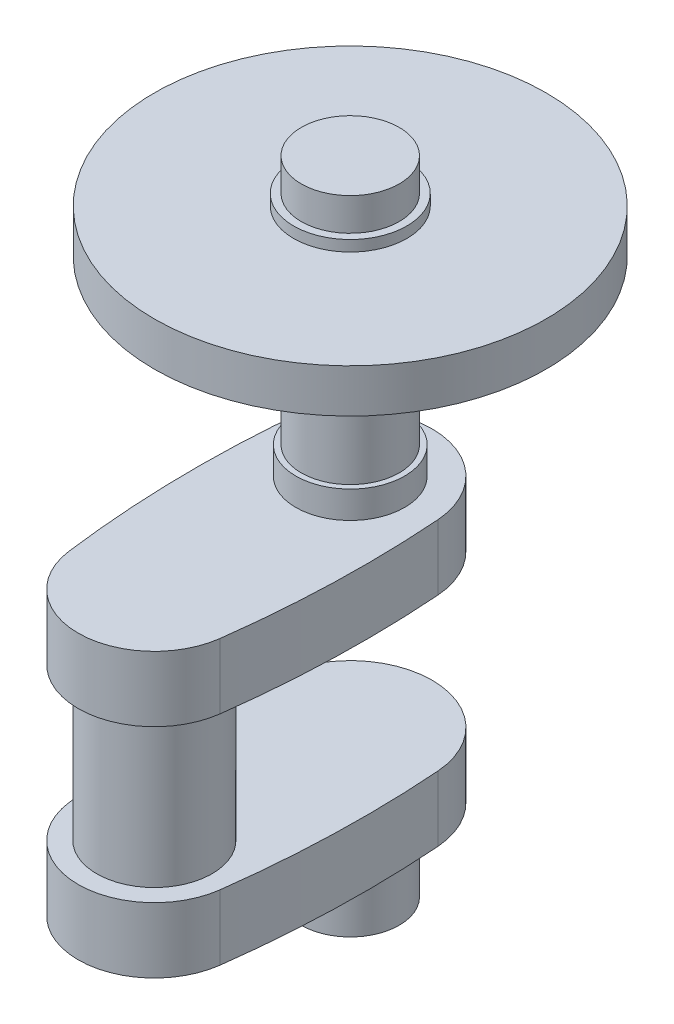
ISO-10303-21;
HEADER;
FILE_DESCRIPTION(('STEP AP214'),'2;1');
FILE_NAME('part.step','',(''),(''),'','','');
FILE_SCHEMA(('AUTOMOTIVE_DESIGN { 1 0 10303 214 1 1 1 1 }'));
ENDSEC;
DATA;
#1=APPLICATION_CONTEXT('core data for automotive mechanical design processes');
#2=APPLICATION_PROTOCOL_DEFINITION('international standard','automotive_design',2000,#1);
#3=PRODUCT_CONTEXT('',#1,'mechanical');
#4=PRODUCT('Part','Part','',(#3));
#5=PRODUCT_RELATED_PRODUCT_CATEGORY('part','',(#4));
#6=PRODUCT_DEFINITION_FORMATION('','',#4);
#7=PRODUCT_DEFINITION_CONTEXT('part definition',#1,'design');
#8=PRODUCT_DEFINITION('design','',#6,#7);
#9=PRODUCT_DEFINITION_SHAPE('','',#8);
#10=(LENGTH_UNIT() NAMED_UNIT(*) SI_UNIT(.MILLI.,.METRE.));
#11=(NAMED_UNIT(*) PLANE_ANGLE_UNIT() SI_UNIT($,.RADIAN.));
#12=(NAMED_UNIT(*) SI_UNIT($,.STERADIAN.) SOLID_ANGLE_UNIT());
#13=UNCERTAINTY_MEASURE_WITH_UNIT(LENGTH_MEASURE(1.E-05),#10,'distance_accuracy_value','');
#14=(GEOMETRIC_REPRESENTATION_CONTEXT(3) GLOBAL_UNCERTAINTY_ASSIGNED_CONTEXT((#13)) GLOBAL_UNIT_ASSIGNED_CONTEXT((#10,
#11,#12)) REPRESENTATION_CONTEXT('',''));
#15=CARTESIAN_POINT('',(0.,0.,0.));
#16=DIRECTION('',(0.,0.,1.));
#17=DIRECTION('',(1.,0.,0.));
#18=AXIS2_PLACEMENT_3D('',#15,#16,#17);
#19=CARTESIAN_POINT('',(0.,95.,0.));
#20=DIRECTION('',(0.,1.,0.));
#21=DIRECTION('',(0.,0.,1.));
#22=AXIS2_PLACEMENT_3D('',#19,#20,#21);
#23=PLANE('',#22);
#24=CARTESIAN_POINT('',(0.,95.,0.));
#25=DIRECTION('',(0.,1.,0.));
#26=DIRECTION('',(0.,0.,1.));
#27=AXIS2_PLACEMENT_3D('',#24,#25,#26);
#28=CIRCLE('',#27,90.);
#29=CARTESIAN_POINT('',(0.,95.,90.));
#30=VERTEX_POINT('',#29);
#31=EDGE_CURVE('E220',#30,#30,#28,.T.);
#32=ORIENTED_EDGE('',*,*,#31,.T.);
#33=EDGE_LOOP('',(#32));
#34=FACE_BOUND('',#33,.T.);
#35=CARTESIAN_POINT('',(0.,95.,0.));
#36=DIRECTION('',(0.,1.,0.));
#37=DIRECTION('',(0.,0.,1.));
#38=AXIS2_PLACEMENT_3D('',#35,#36,#37);
#39=CIRCLE('',#38,26.);
#40=CARTESIAN_POINT('',(0.,95.,26.));
#41=VERTEX_POINT('',#40);
#42=EDGE_CURVE('E217',#41,#41,#39,.T.);
#43=ORIENTED_EDGE('',*,*,#42,.F.);
#44=EDGE_LOOP('',(#43));
#45=FACE_BOUND('',#44,.T.);
#46=ADVANCED_FACE('F32',(#34,#45),#23,.T.);
#47=CARTESIAN_POINT('',(220.308520154453,-42.5,16.099781946578));
#48=DIRECTION('',(0.,-1.,0.));
#49=DIRECTION('',(0.,0.,-1.));
#50=AXIS2_PLACEMENT_3D('',#47,#48,#49);
#51=PLANE('',#50);
#52=CARTESIAN_POINT('',(440.617040308905,-42.5,32.199563893156));
#53=DIRECTION('',(0.,-1.,0.));
#54=DIRECTION('',(0.,0.,-1.));
#55=AXIS2_PLACEMENT_3D('',#52,#53,#54);
#56=CIRCLE('',#55,479.392019083062);
#57=CARTESIAN_POINT('',(-34.7026853511723,-42.5,94.5523213218674));
#58=VERTEX_POINT('',#57);
#59=CARTESIAN_POINT('',(-37.5,-42.5,-2.7404379212089));
#60=VERTEX_POINT('',#59);
#61=EDGE_CURVE('E174',#58,#60,#56,.T.);
#62=ORIENTED_EDGE('',*,*,#61,.T.);
#63=CARTESIAN_POINT('',(0.,-42.5,0.));
#64=DIRECTION('',(0.,-1.,0.));
#65=DIRECTION('',(0.,0.,-1.));
#66=AXIS2_PLACEMENT_3D('',#63,#64,#65);
#67=CIRCLE('',#66,37.6);
#68=CARTESIAN_POINT('',(37.5,-42.5,-2.74043792120891));
#69=VERTEX_POINT('',#68);
#70=EDGE_CURVE('E83',#60,#69,#67,.T.);
#71=ORIENTED_EDGE('',*,*,#70,.T.);
#72=CARTESIAN_POINT('',(-440.617040308905,-42.5,32.199563893156));
#73=DIRECTION('',(0.,-1.,0.));
#74=DIRECTION('',(0.,0.,1.));
#75=AXIS2_PLACEMENT_3D('',#72,#73,#74);
#76=CIRCLE('',#75,479.392019083062);
#77=CARTESIAN_POINT('',(34.7026853511724,-42.5,94.5523213218674));
#78=VERTEX_POINT('',#77);
#79=EDGE_CURVE('E177',#69,#78,#76,.T.);
#80=ORIENTED_EDGE('',*,*,#79,.T.);
#81=CARTESIAN_POINT('',(0.,-42.5,90.));
#82=DIRECTION('',(0.,-1.,0.));
#83=DIRECTION('',(0.,0.,-1.));
#84=AXIS2_PLACEMENT_3D('',#81,#82,#83);
#85=CIRCLE('',#84,35.);
#86=EDGE_CURVE('E51',#78,#58,#85,.T.);
#87=ORIENTED_EDGE('',*,*,#86,.T.);
#88=EDGE_LOOP('',(#62,#71,#80,#87));
#89=FACE_BOUND('',#88,.T.);
#90=CARTESIAN_POINT('',(0.,-42.5,90.));
#91=DIRECTION('',(0.,-1.,0.));
#92=DIRECTION('',(0.,0.,-1.));
#93=AXIS2_PLACEMENT_3D('',#90,#91,#92);
#94=CIRCLE('',#93,26.5);
#95=CARTESIAN_POINT('',(0.,-42.5,63.5));
#96=VERTEX_POINT('',#95);
#97=EDGE_CURVE('E170',#96,#96,#94,.T.);
#98=ORIENTED_EDGE('',*,*,#97,.F.);
#99=EDGE_LOOP('',(#98));
#100=FACE_BOUND('',#99,.T.);
#101=ADVANCED_FACE('F249',(#89,#100),#51,.T.);
#102=CARTESIAN_POINT('',(0.,25.,0.));
#103=DIRECTION('',(0.,-1.,0.));
#104=DIRECTION('',(0.,0.,-1.));
#105=AXIS2_PLACEMENT_3D('',#102,#103,#104);
#106=CYLINDRICAL_SURFACE('',#105,22.5);
#107=CARTESIAN_POINT('',(0.,70.,0.));
#108=DIRECTION('',(0.,-1.,0.));
#109=DIRECTION('',(0.,0.,-1.));
#110=AXIS2_PLACEMENT_3D('',#107,#108,#109);
#111=CIRCLE('',#110,22.5);
#112=CARTESIAN_POINT('',(0.,70.,-22.5));
#113=VERTEX_POINT('',#112);
#114=EDGE_CURVE('E201',#113,#113,#111,.T.);
#115=ORIENTED_EDGE('',*,*,#114,.T.);
#116=EDGE_LOOP('',(#115));
#117=FACE_BOUND('',#116,.T.);
#118=CARTESIAN_POINT('',(0.,0.,0.));
#119=DIRECTION('',(0.,1.,0.));
#120=DIRECTION('',(0.,0.,1.));
#121=AXIS2_PLACEMENT_3D('',#118,#119,#120);
#122=CIRCLE('',#121,22.5);
#123=CARTESIAN_POINT('',(0.,0.,22.5));
#124=VERTEX_POINT('',#123);
#125=EDGE_CURVE('E42',#124,#124,#122,.T.);
#126=ORIENTED_EDGE('',*,*,#125,.T.);
#127=EDGE_LOOP('',(#126));
#128=FACE_BOUND('',#127,.T.);
#129=ADVANCED_FACE('F34',(#117,#128),#106,.T.);
#130=CARTESIAN_POINT('',(0.,0.,0.));
#131=DIRECTION('',(0.,1.,0.));
#132=DIRECTION('',(0.,0.,1.));
#133=AXIS2_PLACEMENT_3D('',#130,#131,#132);
#134=PLANE('',#133);
#135=CARTESIAN_POINT('',(0.,0.,0.));
#136=DIRECTION('',(0.,1.,0.));
#137=DIRECTION('',(0.,0.,1.));
#138=AXIS2_PLACEMENT_3D('',#135,#136,#137);
#139=CIRCLE('',#138,25.);
#140=CARTESIAN_POINT('',(0.,0.,25.));
#141=VERTEX_POINT('',#140);
#142=EDGE_CURVE('E197',#141,#141,#139,.T.);
#143=ORIENTED_EDGE('',*,*,#142,.T.);
#144=EDGE_LOOP('',(#143));
#145=FACE_BOUND('',#144,.T.);
#146=ORIENTED_EDGE('',*,*,#125,.F.);
#147=EDGE_LOOP('',(#146));
#148=FACE_BOUND('',#147,.T.);
#149=ADVANCED_FACE('F315',(#145,#148),#134,.T.);
#150=CARTESIAN_POINT('',(0.,-12.5,0.));
#151=DIRECTION('',(0.,1.,0.));
#152=DIRECTION('',(0.,0.,1.));
#153=AXIS2_PLACEMENT_3D('',#150,#151,#152);
#154=CYLINDRICAL_SURFACE('',#153,25.);
#155=CARTESIAN_POINT('',(0.,-12.5,0.));
#156=DIRECTION('',(0.,-1.,0.));
#157=DIRECTION('',(0.,0.,-1.));
#158=AXIS2_PLACEMENT_3D('',#155,#156,#157);
#159=CIRCLE('',#158,25.);
#160=CARTESIAN_POINT('',(0.,-12.5,-25.));
#161=VERTEX_POINT('',#160);
#162=EDGE_CURVE('E194',#161,#161,#159,.F.);
#163=ORIENTED_EDGE('',*,*,#162,.T.);
#164=EDGE_LOOP('',(#163));
#165=FACE_BOUND('',#164,.T.);
#166=ORIENTED_EDGE('',*,*,#142,.F.);
#167=EDGE_LOOP('',(#166));
#168=FACE_BOUND('',#167,.T.);
#169=ADVANCED_FACE('F313',(#165,#168),#154,.T.);
#170=CARTESIAN_POINT('',(440.617040308905,-42.5,32.199563893156));
#171=DIRECTION('',(0.,1.,0.));
#172=DIRECTION('',(0.,0.,1.));
#173=AXIS2_PLACEMENT_3D('',#170,#171,#172);
#174=CYLINDRICAL_SURFACE('',#173,479.392019083062);
#175=CARTESIAN_POINT('',(440.617040308905,-12.5,32.199563893156));
#176=DIRECTION('',(0.,-1.,0.));
#177=DIRECTION('',(0.,0.,-1.));
#178=AXIS2_PLACEMENT_3D('',#175,#176,#177);
#179=CIRCLE('',#178,479.392019083062);
#180=CARTESIAN_POINT('',(-34.7026853511723,-12.5,94.5523213218674));
#181=VERTEX_POINT('',#180);
#182=CARTESIAN_POINT('',(-37.5,-12.5,-2.7404379212089));
#183=VERTEX_POINT('',#182);
#184=EDGE_CURVE('E173',#181,#183,#179,.T.);
#185=ORIENTED_EDGE('',*,*,#184,.T.);
#186=DIRECTION('',(0.,1.,0.));
#187=VECTOR('',#186,1.);
#188=CARTESIAN_POINT('',(-37.5,-42.5,-2.7404379212089));
#189=LINE('',#188,#187);
#190=EDGE_CURVE('E192',#60,#183,#189,.T.);
#191=ORIENTED_EDGE('',*,*,#190,.F.);
#192=ORIENTED_EDGE('',*,*,#61,.F.);
#193=DIRECTION('',(0.,1.,0.));
#194=VECTOR('',#193,1.);
#195=CARTESIAN_POINT('',(-34.7026853511723,-42.5,94.5523213218674));
#196=LINE('',#195,#194);
#197=EDGE_CURVE('E180',#58,#181,#196,.T.);
#198=ORIENTED_EDGE('',*,*,#197,.T.);
#199=EDGE_LOOP('',(#185,#191,#192,#198));
#200=FACE_BOUND('',#199,.T.);
#201=ADVANCED_FACE('F310',(#200),#174,.T.);
#202=CARTESIAN_POINT('',(0.,-42.5,0.));
#203=DIRECTION('',(0.,1.,0.));
#204=DIRECTION('',(0.,0.,1.));
#205=AXIS2_PLACEMENT_3D('',#202,#203,#204);
#206=CYLINDRICAL_SURFACE('',#205,37.6);
#207=CARTESIAN_POINT('',(0.,-12.5,0.));
#208=DIRECTION('',(0.,-1.,0.));
#209=DIRECTION('',(0.,0.,-1.));
#210=AXIS2_PLACEMENT_3D('',#207,#208,#209);
#211=CIRCLE('',#210,37.6);
#212=CARTESIAN_POINT('',(37.5,-12.5,-2.74043792120891));
#213=VERTEX_POINT('',#212);
#214=EDGE_CURVE('E183',#183,#213,#211,.T.);
#215=ORIENTED_EDGE('',*,*,#214,.T.);
#216=DIRECTION('',(0.,1.,0.));
#217=VECTOR('',#216,1.);
#218=CARTESIAN_POINT('',(37.5,-42.5,-2.74043792120891));
#219=LINE('',#218,#217);
#220=EDGE_CURVE('E190',#69,#213,#219,.T.);
#221=ORIENTED_EDGE('',*,*,#220,.F.);
#222=ORIENTED_EDGE('',*,*,#70,.F.);
#223=ORIENTED_EDGE('',*,*,#190,.T.);
#224=EDGE_LOOP('',(#215,#221,#222,#223));
#225=FACE_BOUND('',#224,.T.);
#226=ADVANCED_FACE('F307',(#225),#206,.T.);
#227=CARTESIAN_POINT('',(-440.617040308905,-42.5,32.199563893156));
#228=DIRECTION('',(0.,1.,0.));
#229=DIRECTION('',(0.,0.,1.));
#230=AXIS2_PLACEMENT_3D('',#227,#228,#229);
#231=CYLINDRICAL_SURFACE('',#230,479.392019083062);
#232=CARTESIAN_POINT('',(-440.617040308905,-12.5,32.199563893156));
#233=DIRECTION('',(0.,-1.,0.));
#234=DIRECTION('',(0.,0.,1.));
#235=AXIS2_PLACEMENT_3D('',#232,#233,#234);
#236=CIRCLE('',#235,479.392019083062);
#237=CARTESIAN_POINT('',(34.7026853511724,-12.5,94.5523213218674));
#238=VERTEX_POINT('',#237);
#239=EDGE_CURVE('E69',#213,#238,#236,.T.);
#240=ORIENTED_EDGE('',*,*,#239,.T.);
#241=DIRECTION('',(0.,1.,0.));
#242=VECTOR('',#241,1.);
#243=CARTESIAN_POINT('',(34.7026853511724,-42.5,94.5523213218674));
#244=LINE('',#243,#242);
#245=EDGE_CURVE('E188',#78,#238,#244,.T.);
#246=ORIENTED_EDGE('',*,*,#245,.F.);
#247=ORIENTED_EDGE('',*,*,#79,.F.);
#248=ORIENTED_EDGE('',*,*,#220,.T.);
#249=EDGE_LOOP('',(#240,#246,#247,#248));
#250=FACE_BOUND('',#249,.T.);
#251=ADVANCED_FACE('F304',(#250),#231,.T.);
#252=CARTESIAN_POINT('',(0.,-42.5,90.));
#253=DIRECTION('',(0.,1.,0.));
#254=DIRECTION('',(0.,0.,1.));
#255=AXIS2_PLACEMENT_3D('',#252,#253,#254);
#256=CYLINDRICAL_SURFACE('',#255,35.);
#257=CARTESIAN_POINT('',(0.,-12.5,90.));
#258=DIRECTION('',(0.,-1.,0.));
#259=DIRECTION('',(0.,0.,-1.));
#260=AXIS2_PLACEMENT_3D('',#257,#258,#259);
#261=CIRCLE('',#260,35.);
#262=EDGE_CURVE('E75',#238,#181,#261,.T.);
#263=ORIENTED_EDGE('',*,*,#262,.T.);
#264=ORIENTED_EDGE('',*,*,#197,.F.);
#265=ORIENTED_EDGE('',*,*,#86,.F.);
#266=ORIENTED_EDGE('',*,*,#245,.T.);
#267=EDGE_LOOP('',(#263,#264,#265,#266));
#268=FACE_BOUND('',#267,.T.);
#269=ADVANCED_FACE('F300',(#268),#256,.T.);
#270=CARTESIAN_POINT('',(220.308520154453,-12.5,16.099781946578));
#271=DIRECTION('',(0.,-1.,0.));
#272=DIRECTION('',(0.,0.,-1.));
#273=AXIS2_PLACEMENT_3D('',#270,#271,#272);
#274=PLANE('',#273);
#275=ORIENTED_EDGE('',*,*,#162,.F.);
#276=EDGE_LOOP('',(#275));
#277=FACE_BOUND('',#276,.T.);
#278=ORIENTED_EDGE('',*,*,#184,.F.);
#279=ORIENTED_EDGE('',*,*,#262,.F.);
#280=ORIENTED_EDGE('',*,*,#239,.F.);
#281=ORIENTED_EDGE('',*,*,#214,.F.);
#282=EDGE_LOOP('',(#278,#279,#280,#281));
#283=FACE_BOUND('',#282,.T.);
#284=ADVANCED_FACE('F295',(#277,#283),#274,.F.);
#285=CARTESIAN_POINT('',(0.,-77.5,90.));
#286=DIRECTION('',(0.,1.,0.));
#287=DIRECTION('',(0.,0.,1.));
#288=AXIS2_PLACEMENT_3D('',#285,#286,#287);
#289=CYLINDRICAL_SURFACE('',#288,26.5);
#290=ORIENTED_EDGE('',*,*,#97,.T.);
#291=EDGE_LOOP('',(#290));
#292=FACE_BOUND('',#291,.T.);
#293=CARTESIAN_POINT('',(0.,-112.5,90.));
#294=DIRECTION('',(0.,-1.,0.));
#295=DIRECTION('',(0.,0.,-1.));
#296=AXIS2_PLACEMENT_3D('',#293,#294,#295);
#297=CIRCLE('',#296,26.5);
#298=CARTESIAN_POINT('',(0.,-112.5,63.5));
#299=VERTEX_POINT('',#298);
#300=EDGE_CURVE('E143',#299,#299,#297,.T.);
#301=ORIENTED_EDGE('',*,*,#300,.F.);
#302=EDGE_LOOP('',(#301));
#303=FACE_BOUND('',#302,.T.);
#304=ADVANCED_FACE('F263',(#292,#303),#289,.T.);
#305=CARTESIAN_POINT('',(220.308520154453,-112.5,16.099781946578));
#306=DIRECTION('',(0.,1.,0.));
#307=DIRECTION('',(0.,0.,-1.));
#308=AXIS2_PLACEMENT_3D('',#305,#306,#307);
#309=PLANE('',#308);
#310=CARTESIAN_POINT('',(440.617040308905,-112.5,32.199563893156));
#311=DIRECTION('',(0.,-1.,0.));
#312=DIRECTION('',(0.,0.,-1.));
#313=AXIS2_PLACEMENT_3D('',#310,#311,#312);
#314=CIRCLE('',#313,479.392019083062);
#315=CARTESIAN_POINT('',(-34.7026853511723,-112.5,94.5523213218674));
#316=VERTEX_POINT('',#315);
#317=CARTESIAN_POINT('',(-37.5,-112.5,-2.7404379212089));
#318=VERTEX_POINT('',#317);
#319=EDGE_CURVE('E130',#316,#318,#314,.T.);
#320=ORIENTED_EDGE('',*,*,#319,.F.);
#321=CARTESIAN_POINT('',(0.,-112.5,90.));
#322=DIRECTION('',(0.,-1.,0.));
#323=DIRECTION('',(0.,0.,-1.));
#324=AXIS2_PLACEMENT_3D('',#321,#322,#323);
#325=CIRCLE('',#324,35.);
#326=CARTESIAN_POINT('',(34.7026853511724,-112.5,94.5523213218674));
#327=VERTEX_POINT('',#326);
#328=EDGE_CURVE('E147',#327,#316,#325,.T.);
#329=ORIENTED_EDGE('',*,*,#328,.F.);
#330=CARTESIAN_POINT('',(-440.617040308905,-112.5,32.199563893156));
#331=DIRECTION('',(0.,-1.,0.));
#332=DIRECTION('',(0.,0.,1.));
#333=AXIS2_PLACEMENT_3D('',#330,#331,#332);
#334=CIRCLE('',#333,479.392019083062);
#335=CARTESIAN_POINT('',(37.5,-112.5,-2.74043792120891));
#336=VERTEX_POINT('',#335);
#337=EDGE_CURVE('E132',#336,#327,#334,.T.);
#338=ORIENTED_EDGE('',*,*,#337,.F.);
#339=CARTESIAN_POINT('',(0.,-112.5,0.));
#340=DIRECTION('',(0.,-1.,0.));
#341=DIRECTION('',(0.,0.,-1.));
#342=AXIS2_PLACEMENT_3D('',#339,#340,#341);
#343=CIRCLE('',#342,37.6);
#344=EDGE_CURVE('E114',#318,#336,#343,.T.);
#345=ORIENTED_EDGE('',*,*,#344,.F.);
#346=EDGE_LOOP('',(#320,#329,#338,#345));
#347=FACE_BOUND('',#346,.T.);
#348=ORIENTED_EDGE('',*,*,#300,.T.);
#349=EDGE_LOOP('',(#348));
#350=FACE_BOUND('',#349,.T.);
#351=ADVANCED_FACE('F127',(#347,#350),#309,.T.);
#352=CARTESIAN_POINT('',(0.,-180.,0.));
#353=DIRECTION('',(0.,1.,0.));
#354=DIRECTION('',(0.,0.,-1.));
#355=AXIS2_PLACEMENT_3D('',#352,#353,#354);
#356=CYLINDRICAL_SURFACE('',#355,22.5);
#357=CARTESIAN_POINT('',(0.,-180.,0.));
#358=DIRECTION('',(0.,1.,0.));
#359=DIRECTION('',(0.,0.,1.));
#360=AXIS2_PLACEMENT_3D('',#357,#358,#359);
#361=CIRCLE('',#360,22.5);
#362=CARTESIAN_POINT('',(0.,-180.,22.5));
#363=VERTEX_POINT('',#362);
#364=EDGE_CURVE('E167',#363,#363,#361,.T.);
#365=ORIENTED_EDGE('',*,*,#364,.T.);
#366=EDGE_LOOP('',(#365));
#367=FACE_BOUND('',#366,.T.);
#368=CARTESIAN_POINT('',(0.,-155.,0.));
#369=DIRECTION('',(0.,1.,0.));
#370=DIRECTION('',(0.,0.,1.));
#371=AXIS2_PLACEMENT_3D('',#368,#369,#370);
#372=CIRCLE('',#371,22.5);
#373=CARTESIAN_POINT('',(0.,-155.,22.5));
#374=VERTEX_POINT('',#373);
#375=EDGE_CURVE('E164',#374,#374,#372,.T.);
#376=ORIENTED_EDGE('',*,*,#375,.F.);
#377=EDGE_LOOP('',(#376));
#378=FACE_BOUND('',#377,.T.);
#379=ADVANCED_FACE('F262',(#367,#378),#356,.T.);
#380=CARTESIAN_POINT('',(0.,-180.,0.));
#381=DIRECTION('',(0.,-1.,0.));
#382=DIRECTION('',(0.,0.,1.));
#383=AXIS2_PLACEMENT_3D('',#380,#381,#382);
#384=PLANE('',#383);
#385=ORIENTED_EDGE('',*,*,#364,.F.);
#386=EDGE_LOOP('',(#385));
#387=FACE_BOUND('',#386,.T.);
#388=ADVANCED_FACE('F283',(#387),#384,.T.);
#389=CARTESIAN_POINT('',(0.,-155.,0.));
#390=DIRECTION('',(0.,-1.,0.));
#391=DIRECTION('',(0.,0.,1.));
#392=AXIS2_PLACEMENT_3D('',#389,#390,#391);
#393=PLANE('',#392);
#394=CARTESIAN_POINT('',(0.,-155.,0.));
#395=DIRECTION('',(0.,1.,0.));
#396=DIRECTION('',(0.,0.,1.));
#397=AXIS2_PLACEMENT_3D('',#394,#395,#396);
#398=CIRCLE('',#397,25.);
#399=CARTESIAN_POINT('',(0.,-155.,25.));
#400=VERTEX_POINT('',#399);
#401=EDGE_CURVE('E161',#400,#400,#398,.T.);
#402=ORIENTED_EDGE('',*,*,#401,.F.);
#403=EDGE_LOOP('',(#402));
#404=FACE_BOUND('',#403,.T.);
#405=ORIENTED_EDGE('',*,*,#375,.T.);
#406=EDGE_LOOP('',(#405));
#407=FACE_BOUND('',#406,.T.);
#408=ADVANCED_FACE('F280',(#404,#407),#393,.T.);
#409=CARTESIAN_POINT('',(0.,-142.5,0.));
#410=DIRECTION('',(0.,-1.,0.));
#411=DIRECTION('',(0.,0.,1.));
#412=AXIS2_PLACEMENT_3D('',#409,#410,#411);
#413=CYLINDRICAL_SURFACE('',#412,25.);
#414=CARTESIAN_POINT('',(0.,-142.5,0.));
#415=DIRECTION('',(0.,-1.,0.));
#416=DIRECTION('',(0.,0.,-1.));
#417=AXIS2_PLACEMENT_3D('',#414,#415,#416);
#418=CIRCLE('',#417,25.);
#419=CARTESIAN_POINT('',(0.,-142.5,-25.));
#420=VERTEX_POINT('',#419);
#421=EDGE_CURVE('E122',#420,#420,#418,.F.);
#422=ORIENTED_EDGE('',*,*,#421,.F.);
#423=EDGE_LOOP('',(#422));
#424=FACE_BOUND('',#423,.T.);
#425=ORIENTED_EDGE('',*,*,#401,.T.);
#426=EDGE_LOOP('',(#425));
#427=FACE_BOUND('',#426,.T.);
#428=ADVANCED_FACE('F279',(#424,#427),#413,.T.);
#429=CARTESIAN_POINT('',(440.617040308905,-112.5,32.199563893156));
#430=DIRECTION('',(0.,-1.,0.));
#431=DIRECTION('',(0.,0.,1.));
#432=AXIS2_PLACEMENT_3D('',#429,#430,#431);
#433=CYLINDRICAL_SURFACE('',#432,479.392019083062);
#434=CARTESIAN_POINT('',(440.617040308905,-142.5,32.199563893156));
#435=DIRECTION('',(0.,-1.,0.));
#436=DIRECTION('',(0.,0.,-1.));
#437=AXIS2_PLACEMENT_3D('',#434,#435,#436);
#438=CIRCLE('',#437,479.392019083062);
#439=CARTESIAN_POINT('',(-34.7026853511723,-142.5,94.5523213218674));
#440=VERTEX_POINT('',#439);
#441=CARTESIAN_POINT('',(-37.5,-142.5,-2.7404379212089));
#442=VERTEX_POINT('',#441);
#443=EDGE_CURVE('E149',#440,#442,#438,.T.);
#444=ORIENTED_EDGE('',*,*,#443,.F.);
#445=DIRECTION('',(0.,-1.,0.));
#446=VECTOR('',#445,1.);
#447=CARTESIAN_POINT('',(-34.7026853511723,-112.5,94.5523213218674));
#448=LINE('',#447,#446);
#449=EDGE_CURVE('E136',#316,#440,#448,.T.);
#450=ORIENTED_EDGE('',*,*,#449,.F.);
#451=ORIENTED_EDGE('',*,*,#319,.T.);
#452=DIRECTION('',(0.,-1.,0.));
#453=VECTOR('',#452,1.);
#454=CARTESIAN_POINT('',(-37.5,-112.5,-2.7404379212089));
#455=LINE('',#454,#453);
#456=EDGE_CURVE('E110',#318,#442,#455,.T.);
#457=ORIENTED_EDGE('',*,*,#456,.T.);
#458=EDGE_LOOP('',(#444,#450,#451,#457));
#459=FACE_BOUND('',#458,.T.);
#460=ADVANCED_FACE('F134',(#459),#433,.T.);
#461=CARTESIAN_POINT('',(0.,-112.5,0.));
#462=DIRECTION('',(0.,-1.,0.));
#463=DIRECTION('',(0.,0.,1.));
#464=AXIS2_PLACEMENT_3D('',#461,#462,#463);
#465=CYLINDRICAL_SURFACE('',#464,37.6);
#466=CARTESIAN_POINT('',(0.,-142.5,0.));
#467=DIRECTION('',(0.,-1.,0.));
#468=DIRECTION('',(0.,0.,-1.));
#469=AXIS2_PLACEMENT_3D('',#466,#467,#468);
#470=CIRCLE('',#469,37.6);
#471=CARTESIAN_POINT('',(37.5,-142.5,-2.74043792120891));
#472=VERTEX_POINT('',#471);
#473=EDGE_CURVE('E117',#442,#472,#470,.T.);
#474=ORIENTED_EDGE('',*,*,#473,.F.);
#475=ORIENTED_EDGE('',*,*,#456,.F.);
#476=ORIENTED_EDGE('',*,*,#344,.T.);
#477=DIRECTION('',(0.,-1.,0.));
#478=VECTOR('',#477,1.);
#479=CARTESIAN_POINT('',(37.5,-112.5,-2.74043792120891));
#480=LINE('',#479,#478);
#481=EDGE_CURVE('E123',#336,#472,#480,.T.);
#482=ORIENTED_EDGE('',*,*,#481,.T.);
#483=EDGE_LOOP('',(#474,#475,#476,#482));
#484=FACE_BOUND('',#483,.T.);
#485=ADVANCED_FACE('F112',(#484),#465,.T.);
#486=CARTESIAN_POINT('',(-440.617040308905,-112.5,32.199563893156));
#487=DIRECTION('',(0.,-1.,0.));
#488=DIRECTION('',(0.,0.,1.));
#489=AXIS2_PLACEMENT_3D('',#486,#487,#488);
#490=CYLINDRICAL_SURFACE('',#489,479.392019083062);
#491=CARTESIAN_POINT('',(-440.617040308905,-142.5,32.199563893156));
#492=DIRECTION('',(0.,-1.,0.));
#493=DIRECTION('',(0.,0.,1.));
#494=AXIS2_PLACEMENT_3D('',#491,#492,#493);
#495=CIRCLE('',#494,479.392019083062);
#496=CARTESIAN_POINT('',(34.7026853511724,-142.5,94.5523213218674));
#497=VERTEX_POINT('',#496);
#498=EDGE_CURVE('E140',#472,#497,#495,.T.);
#499=ORIENTED_EDGE('',*,*,#498,.F.);
#500=ORIENTED_EDGE('',*,*,#481,.F.);
#501=ORIENTED_EDGE('',*,*,#337,.T.);
#502=DIRECTION('',(0.,-1.,0.));
#503=VECTOR('',#502,1.);
#504=CARTESIAN_POINT('',(34.7026853511724,-112.5,94.5523213218674));
#505=LINE('',#504,#503);
#506=EDGE_CURVE('E155',#327,#497,#505,.T.);
#507=ORIENTED_EDGE('',*,*,#506,.T.);
#508=EDGE_LOOP('',(#499,#500,#501,#507));
#509=FACE_BOUND('',#508,.T.);
#510=ADVANCED_FACE('F270',(#509),#490,.T.);
#511=CARTESIAN_POINT('',(0.,-112.5,90.));
#512=DIRECTION('',(0.,-1.,0.));
#513=DIRECTION('',(0.,0.,1.));
#514=AXIS2_PLACEMENT_3D('',#511,#512,#513);
#515=CYLINDRICAL_SURFACE('',#514,35.);
#516=CARTESIAN_POINT('',(0.,-142.5,90.));
#517=DIRECTION('',(0.,-1.,0.));
#518=DIRECTION('',(0.,0.,-1.));
#519=AXIS2_PLACEMENT_3D('',#516,#517,#518);
#520=CIRCLE('',#519,35.);
#521=EDGE_CURVE('E138',#497,#440,#520,.T.);
#522=ORIENTED_EDGE('',*,*,#521,.F.);
#523=ORIENTED_EDGE('',*,*,#506,.F.);
#524=ORIENTED_EDGE('',*,*,#328,.T.);
#525=ORIENTED_EDGE('',*,*,#449,.T.);
#526=EDGE_LOOP('',(#522,#523,#524,#525));
#527=FACE_BOUND('',#526,.T.);
#528=ADVANCED_FACE('F266',(#527),#515,.T.);
#529=CARTESIAN_POINT('',(220.308520154453,-142.5,16.099781946578));
#530=DIRECTION('',(0.,1.,0.));
#531=DIRECTION('',(0.,0.,-1.));
#532=AXIS2_PLACEMENT_3D('',#529,#530,#531);
#533=PLANE('',#532);
#534=ORIENTED_EDGE('',*,*,#421,.T.);
#535=EDGE_LOOP('',(#534));
#536=FACE_BOUND('',#535,.T.);
#537=ORIENTED_EDGE('',*,*,#443,.T.);
#538=ORIENTED_EDGE('',*,*,#473,.T.);
#539=ORIENTED_EDGE('',*,*,#498,.T.);
#540=ORIENTED_EDGE('',*,*,#521,.T.);
#541=EDGE_LOOP('',(#537,#538,#539,#540));
#542=FACE_BOUND('',#541,.T.);
#543=ADVANCED_FACE('F245',(#536,#542),#533,.F.);
#544=CARTESIAN_POINT('',(0.,70.,0.));
#545=DIRECTION('',(0.,-1.,0.));
#546=DIRECTION('',(0.,0.,-1.));
#547=AXIS2_PLACEMENT_3D('',#544,#545,#546);
#548=PLANE('',#547);
#549=CARTESIAN_POINT('',(0.,70.,0.));
#550=DIRECTION('',(0.,-1.,0.));
#551=DIRECTION('',(0.,0.,-1.));
#552=AXIS2_PLACEMENT_3D('',#549,#550,#551);
#553=CIRCLE('',#552,26.);
#554=CARTESIAN_POINT('',(0.,70.,-26.));
#555=VERTEX_POINT('',#554);
#556=EDGE_CURVE('E204',#555,#555,#553,.T.);
#557=ORIENTED_EDGE('',*,*,#556,.T.);
#558=EDGE_LOOP('',(#557));
#559=FACE_BOUND('',#558,.T.);
#560=ORIENTED_EDGE('',*,*,#114,.F.);
#561=EDGE_LOOP('',(#560));
#562=FACE_BOUND('',#561,.T.);
#563=ADVANCED_FACE('F236',(#559,#562),#548,.T.);
#564=CARTESIAN_POINT('',(0.,70.,0.));
#565=DIRECTION('',(0.,1.,0.));
#566=DIRECTION('',(0.,0.,1.));
#567=AXIS2_PLACEMENT_3D('',#564,#565,#566);
#568=CYLINDRICAL_SURFACE('',#567,26.);
#569=ORIENTED_EDGE('',*,*,#556,.F.);
#570=EDGE_LOOP('',(#569));
#571=FACE_BOUND('',#570,.T.);
#572=CARTESIAN_POINT('',(0.,75.,0.));
#573=DIRECTION('',(0.,1.,0.));
#574=DIRECTION('',(0.,0.,1.));
#575=AXIS2_PLACEMENT_3D('',#572,#573,#574);
#576=CIRCLE('',#575,26.);
#577=CARTESIAN_POINT('',(0.,75.,26.));
#578=VERTEX_POINT('',#577);
#579=EDGE_CURVE('E11',#578,#578,#576,.F.);
#580=ORIENTED_EDGE('',*,*,#579,.T.);
#581=EDGE_LOOP('',(#580));
#582=FACE_BOUND('',#581,.T.);
#583=ADVANCED_FACE('F234',(#571,#582),#568,.T.);
#584=CARTESIAN_POINT('',(0.,95.,0.));
#585=DIRECTION('',(0.,-1.,0.));
#586=DIRECTION('',(0.,0.,-1.));
#587=AXIS2_PLACEMENT_3D('',#584,#585,#586);
#588=CYLINDRICAL_SURFACE('',#587,90.);
#589=ORIENTED_EDGE('',*,*,#31,.F.);
#590=EDGE_LOOP('',(#589));
#591=FACE_BOUND('',#590,.T.);
#592=CARTESIAN_POINT('',(0.,75.,0.));
#593=DIRECTION('',(0.,1.,0.));
#594=DIRECTION('',(0.,0.,1.));
#595=AXIS2_PLACEMENT_3D('',#592,#593,#594);
#596=CIRCLE('',#595,90.);
#597=CARTESIAN_POINT('',(0.,75.,90.));
#598=VERTEX_POINT('',#597);
#599=EDGE_CURVE('E208',#598,#598,#596,.T.);
#600=ORIENTED_EDGE('',*,*,#599,.T.);
#601=EDGE_LOOP('',(#600));
#602=FACE_BOUND('',#601,.T.);
#603=ADVANCED_FACE('F225',(#591,#602),#588,.T.);
#604=CARTESIAN_POINT('',(0.,75.,0.));
#605=DIRECTION('',(0.,1.,0.));
#606=DIRECTION('',(0.,0.,1.));
#607=AXIS2_PLACEMENT_3D('',#604,#605,#606);
#608=PLANE('',#607);
#609=ORIENTED_EDGE('',*,*,#599,.F.);
#610=EDGE_LOOP('',(#609));
#611=FACE_BOUND('',#610,.T.);
#612=ORIENTED_EDGE('',*,*,#579,.F.);
#613=EDGE_LOOP('',(#612));
#614=FACE_BOUND('',#613,.T.);
#615=ADVANCED_FACE('F227',(#611,#614),#608,.F.);
#616=CARTESIAN_POINT('',(0.,100.,0.));
#617=DIRECTION('',(0.,1.,0.));
#618=DIRECTION('',(0.,0.,1.));
#619=AXIS2_PLACEMENT_3D('',#616,#617,#618);
#620=PLANE('',#619);
#621=CARTESIAN_POINT('',(0.,100.,0.));
#622=DIRECTION('',(0.,1.,0.));
#623=DIRECTION('',(0.,0.,1.));
#624=AXIS2_PLACEMENT_3D('',#621,#622,#623);
#625=CIRCLE('',#624,26.);
#626=CARTESIAN_POINT('',(0.,100.,26.));
#627=VERTEX_POINT('',#626);
#628=EDGE_CURVE('E215',#627,#627,#625,.T.);
#629=ORIENTED_EDGE('',*,*,#628,.T.);
#630=EDGE_LOOP('',(#629));
#631=FACE_BOUND('',#630,.T.);
#632=CARTESIAN_POINT('',(0.,100.,0.));
#633=DIRECTION('',(0.,1.,0.));
#634=DIRECTION('',(0.,0.,1.));
#635=AXIS2_PLACEMENT_3D('',#632,#633,#634);
#636=CIRCLE('',#635,22.5);
#637=CARTESIAN_POINT('',(0.,100.,22.5));
#638=VERTEX_POINT('',#637);
#639=EDGE_CURVE('E36',#638,#638,#636,.T.);
#640=ORIENTED_EDGE('',*,*,#639,.F.);
#641=EDGE_LOOP('',(#640));
#642=FACE_BOUND('',#641,.T.);
#643=ADVANCED_FACE('F230',(#631,#642),#620,.T.);
#644=CARTESIAN_POINT('',(0.,100.,0.));
#645=DIRECTION('',(0.,-1.,0.));
#646=DIRECTION('',(0.,0.,-1.));
#647=AXIS2_PLACEMENT_3D('',#644,#645,#646);
#648=CYLINDRICAL_SURFACE('',#647,26.);
#649=ORIENTED_EDGE('',*,*,#628,.F.);
#650=EDGE_LOOP('',(#649));
#651=FACE_BOUND('',#650,.T.);
#652=ORIENTED_EDGE('',*,*,#42,.T.);
#653=EDGE_LOOP('',(#652));
#654=FACE_BOUND('',#653,.T.);
#655=ADVANCED_FACE('F456',(#651,#654),#648,.T.);
#656=CARTESIAN_POINT('',(0.,115.,0.));
#657=DIRECTION('',(0.,1.,0.));
#658=DIRECTION('',(0.,0.,1.));
#659=AXIS2_PLACEMENT_3D('',#656,#657,#658);
#660=PLANE('',#659);
#661=CARTESIAN_POINT('',(0.,115.,0.));
#662=DIRECTION('',(0.,1.,0.));
#663=DIRECTION('',(0.,0.,1.));
#664=AXIS2_PLACEMENT_3D('',#661,#662,#663);
#665=CIRCLE('',#664,22.5);
#666=CARTESIAN_POINT('',(0.,115.,22.5));
#667=VERTEX_POINT('',#666);
#668=EDGE_CURVE('E203',#667,#667,#665,.T.);
#669=ORIENTED_EDGE('',*,*,#668,.T.);
#670=EDGE_LOOP('',(#669));
#671=FACE_BOUND('',#670,.T.);
#672=ADVANCED_FACE('F452',(#671),#660,.T.);
#673=CARTESIAN_POINT('',(0.,115.,0.));
#674=DIRECTION('',(0.,-1.,0.));
#675=DIRECTION('',(0.,0.,-1.));
#676=AXIS2_PLACEMENT_3D('',#673,#674,#675);
#677=CYLINDRICAL_SURFACE('',#676,22.5);
#678=ORIENTED_EDGE('',*,*,#639,.T.);
#679=EDGE_LOOP('',(#678));
#680=FACE_BOUND('',#679,.T.);
#681=ORIENTED_EDGE('',*,*,#668,.F.);
#682=EDGE_LOOP('',(#681));
#683=FACE_BOUND('',#682,.T.);
#684=ADVANCED_FACE('F258',(#680,#683),#677,.T.);
#685=CLOSED_SHELL('',(#46,#101,#129,#149,#169,#201,#226,#251,#269,#284,#304,#351,#379,#388,#408,
#428,#460,#485,#510,#528,#543,#563,#583,#603,#615,#643,#655,#672,#684));
#686=MANIFOLD_SOLID_BREP('B2',#685);
#687=ADVANCED_BREP_SHAPE_REPRESENTATION('',(#18,#686),#14);
#688=SHAPE_DEFINITION_REPRESENTATION(#9,#687);
ENDSEC;
END-ISO-10303-21;
